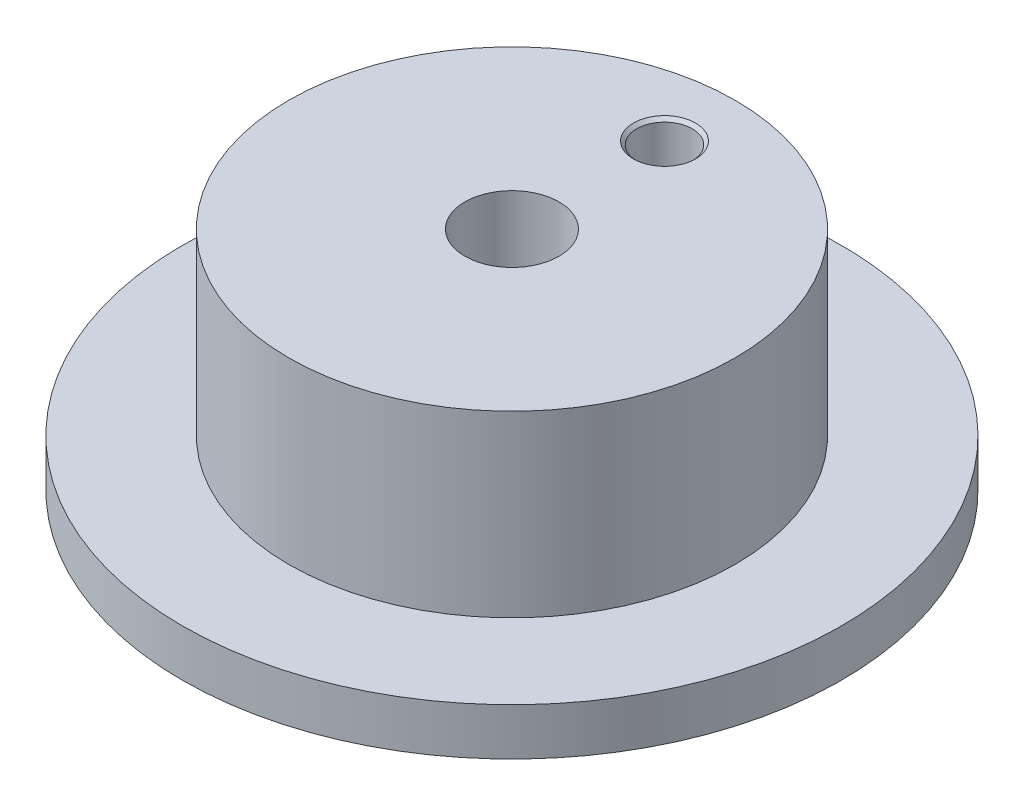
ISO-10303-21;
HEADER;
FILE_DESCRIPTION(('STEP AP214'),'2;1');
FILE_NAME('part.step','',(''),(''),'','','');
FILE_SCHEMA(('AUTOMOTIVE_DESIGN { 1 0 10303 214 1 1 1 1 }'));
ENDSEC;
DATA;
#1=APPLICATION_CONTEXT('core data for automotive mechanical design processes');
#2=APPLICATION_PROTOCOL_DEFINITION('international standard','automotive_design',2000,#1);
#3=PRODUCT_CONTEXT('',#1,'mechanical');
#4=PRODUCT('Part','Part','',(#3));
#5=PRODUCT_RELATED_PRODUCT_CATEGORY('part','',(#4));
#6=PRODUCT_DEFINITION_FORMATION('','',#4);
#7=PRODUCT_DEFINITION_CONTEXT('part definition',#1,'design');
#8=PRODUCT_DEFINITION('design','',#6,#7);
#9=PRODUCT_DEFINITION_SHAPE('','',#8);
#10=(LENGTH_UNIT() NAMED_UNIT(*) SI_UNIT(.MILLI.,.METRE.));
#11=(NAMED_UNIT(*) PLANE_ANGLE_UNIT() SI_UNIT($,.RADIAN.));
#12=(NAMED_UNIT(*) SI_UNIT($,.STERADIAN.) SOLID_ANGLE_UNIT());
#13=UNCERTAINTY_MEASURE_WITH_UNIT(LENGTH_MEASURE(1.E-05),#10,'distance_accuracy_value','');
#14=(GEOMETRIC_REPRESENTATION_CONTEXT(3) GLOBAL_UNCERTAINTY_ASSIGNED_CONTEXT((#13)) GLOBAL_UNIT_ASSIGNED_CONTEXT((#10,
#11,#12)) REPRESENTATION_CONTEXT('',''));
#15=CARTESIAN_POINT('',(0.,0.,0.));
#16=DIRECTION('',(0.,0.,1.));
#17=DIRECTION('',(1.,0.,0.));
#18=AXIS2_PLACEMENT_3D('',#15,#16,#17);
#19=CARTESIAN_POINT('',(-47.4,0.,0.));
#20=DIRECTION('',(0.,1.,0.));
#21=DIRECTION('',(0.,0.,1.));
#22=AXIS2_PLACEMENT_3D('',#19,#20,#21);
#23=PLANE('',#22);
#24=CARTESIAN_POINT('',(0.,0.,-32.4));
#25=DIRECTION('',(0.,1.,0.));
#26=DIRECTION('',(0.,0.,1.));
#27=AXIS2_PLACEMENT_3D('',#24,#25,#26);
#28=CIRCLE('',#27,6.6035);
#29=CARTESIAN_POINT('',(0.,0.,-25.7965));
#30=VERTEX_POINT('',#29);
#31=EDGE_CURVE('E195',#30,#30,#28,.T.);
#32=ORIENTED_EDGE('',*,*,#31,.F.);
#33=EDGE_LOOP('',(#32));
#34=FACE_BOUND('',#33,.T.);
#35=CARTESIAN_POINT('',(0.,0.,0.));
#36=DIRECTION('',(0.,1.,0.));
#37=DIRECTION('',(0.,0.,1.));
#38=AXIS2_PLACEMENT_3D('',#35,#36,#37);
#39=CIRCLE('',#38,47.4);
#40=CARTESIAN_POINT('',(0.,0.,47.4));
#41=VERTEX_POINT('',#40);
#42=EDGE_CURVE('E10',#41,#41,#39,.T.);
#43=ORIENTED_EDGE('',*,*,#42,.T.);
#44=EDGE_LOOP('',(#43));
#45=FACE_BOUND('',#44,.T.);
#46=CARTESIAN_POINT('',(0.,0.,0.));
#47=DIRECTION('',(0.,1.,0.));
#48=DIRECTION('',(0.,0.,1.));
#49=AXIS2_PLACEMENT_3D('',#46,#47,#48);
#50=CIRCLE('',#49,10.);
#51=CARTESIAN_POINT('',(0.,0.,10.));
#52=VERTEX_POINT('',#51);
#53=EDGE_CURVE('E183',#52,#52,#50,.T.);
#54=ORIENTED_EDGE('',*,*,#53,.F.);
#55=EDGE_LOOP('',(#54));
#56=FACE_BOUND('',#55,.T.);
#57=ADVANCED_FACE('F44',(#34,#45,#56),#23,.T.);
#58=CARTESIAN_POINT('',(0.,0.,0.));
#59=DIRECTION('',(0.,1.,0.));
#60=DIRECTION('',(0.,0.,1.));
#61=AXIS2_PLACEMENT_3D('',#58,#59,#60);
#62=CYLINDRICAL_SURFACE('',#61,47.4);
#63=CARTESIAN_POINT('',(0.,-38.,0.));
#64=DIRECTION('',(0.,1.,0.));
#65=DIRECTION('',(0.,0.,1.));
#66=AXIS2_PLACEMENT_3D('',#63,#64,#65);
#67=CIRCLE('',#66,47.4);
#68=CARTESIAN_POINT('',(0.,-38.,47.4));
#69=VERTEX_POINT('',#68);
#70=EDGE_CURVE('E51',#69,#69,#67,.T.);
#71=ORIENTED_EDGE('',*,*,#70,.T.);
#72=EDGE_LOOP('',(#71));
#73=FACE_BOUND('',#72,.T.);
#74=ORIENTED_EDGE('',*,*,#42,.F.);
#75=EDGE_LOOP('',(#74));
#76=FACE_BOUND('',#75,.T.);
#77=ADVANCED_FACE('F203',(#73,#76),#62,.T.);
#78=CARTESIAN_POINT('',(-70.,-38.,0.));
#79=DIRECTION('',(0.,1.,0.));
#80=DIRECTION('',(0.,0.,1.));
#81=AXIS2_PLACEMENT_3D('',#78,#79,#80);
#82=PLANE('',#81);
#83=CARTESIAN_POINT('',(0.,-38.,0.));
#84=DIRECTION('',(0.,1.,0.));
#85=DIRECTION('',(0.,0.,1.));
#86=AXIS2_PLACEMENT_3D('',#83,#84,#85);
#87=CIRCLE('',#86,70.);
#88=CARTESIAN_POINT('',(0.,-38.,70.));
#89=VERTEX_POINT('',#88);
#90=EDGE_CURVE('E56',#89,#89,#87,.T.);
#91=ORIENTED_EDGE('',*,*,#90,.T.);
#92=EDGE_LOOP('',(#91));
#93=FACE_BOUND('',#92,.T.);
#94=ORIENTED_EDGE('',*,*,#70,.F.);
#95=EDGE_LOOP('',(#94));
#96=FACE_BOUND('',#95,.T.);
#97=ADVANCED_FACE('F392',(#93,#96),#82,.T.);
#98=CARTESIAN_POINT('',(0.,0.,0.));
#99=DIRECTION('',(0.,1.,0.));
#100=DIRECTION('',(0.,0.,1.));
#101=AXIS2_PLACEMENT_3D('',#98,#99,#100);
#102=CYLINDRICAL_SURFACE('',#101,70.);
#103=CARTESIAN_POINT('',(0.,-48.,0.));
#104=DIRECTION('',(0.,1.,0.));
#105=DIRECTION('',(0.,0.,1.));
#106=AXIS2_PLACEMENT_3D('',#103,#104,#105);
#107=CIRCLE('',#106,70.);
#108=CARTESIAN_POINT('',(0.,-48.,70.));
#109=VERTEX_POINT('',#108);
#110=EDGE_CURVE('E61',#109,#109,#107,.T.);
#111=ORIENTED_EDGE('',*,*,#110,.T.);
#112=EDGE_LOOP('',(#111));
#113=FACE_BOUND('',#112,.T.);
#114=ORIENTED_EDGE('',*,*,#90,.F.);
#115=EDGE_LOOP('',(#114));
#116=FACE_BOUND('',#115,.T.);
#117=ADVANCED_FACE('F386',(#113,#116),#102,.T.);
#118=CARTESIAN_POINT('',(-51.,-48.,0.));
#119=DIRECTION('',(0.,-1.,0.));
#120=DIRECTION('',(0.,0.,-1.));
#121=AXIS2_PLACEMENT_3D('',#118,#119,#120);
#122=PLANE('',#121);
#123=CARTESIAN_POINT('',(0.,-48.,0.));
#124=DIRECTION('',(0.,1.,0.));
#125=DIRECTION('',(0.,0.,1.));
#126=AXIS2_PLACEMENT_3D('',#123,#124,#125);
#127=CIRCLE('',#126,51.);
#128=CARTESIAN_POINT('',(0.,-48.,51.));
#129=VERTEX_POINT('',#128);
#130=EDGE_CURVE('E67',#129,#129,#127,.T.);
#131=ORIENTED_EDGE('',*,*,#130,.T.);
#132=EDGE_LOOP('',(#131));
#133=FACE_BOUND('',#132,.T.);
#134=ORIENTED_EDGE('',*,*,#110,.F.);
#135=EDGE_LOOP('',(#134));
#136=FACE_BOUND('',#135,.T.);
#137=ADVANCED_FACE('F380',(#133,#136),#122,.T.);
#138=CARTESIAN_POINT('',(0.,0.,0.));
#139=DIRECTION('',(0.,1.,0.));
#140=DIRECTION('',(0.,0.,1.));
#141=AXIS2_PLACEMENT_3D('',#138,#139,#140);
#142=CYLINDRICAL_SURFACE('',#141,51.);
#143=CARTESIAN_POINT('',(0.,-46.2080332580664,0.));
#144=DIRECTION('',(0.,1.,0.));
#145=DIRECTION('',(0.,0.,1.));
#146=AXIS2_PLACEMENT_3D('',#143,#144,#145);
#147=CIRCLE('',#146,51.);
#148=CARTESIAN_POINT('',(0.,-46.2080332580664,51.));
#149=VERTEX_POINT('',#148);
#150=EDGE_CURVE('E71',#149,#149,#147,.T.);
#151=ORIENTED_EDGE('',*,*,#150,.T.);
#152=EDGE_LOOP('',(#151));
#153=FACE_BOUND('',#152,.T.);
#154=ORIENTED_EDGE('',*,*,#130,.F.);
#155=EDGE_LOOP('',(#154));
#156=FACE_BOUND('',#155,.T.);
#157=ADVANCED_FACE('F374',(#153,#156),#142,.F.);
#158=CARTESIAN_POINT('',(0.,-46.2080332580664,0.));
#159=DIRECTION('',(0.,1.,0.));
#160=DIRECTION('',(0.,0.,1.));
#161=AXIS2_PLACEMENT_3D('',#158,#159,#160);
#162=TOROIDAL_SURFACE('',#161,50.7919667419336,0.208033258066391);
#163=CARTESIAN_POINT('',(0.,-46.,0.));
#164=DIRECTION('',(0.,1.,0.));
#165=DIRECTION('',(0.,0.,1.));
#166=AXIS2_PLACEMENT_3D('',#163,#164,#165);
#167=CIRCLE('',#166,50.7919667419336);
#168=CARTESIAN_POINT('',(0.,-46.,50.7919667419336));
#169=VERTEX_POINT('',#168);
#170=EDGE_CURVE('E75',#169,#169,#167,.T.);
#171=ORIENTED_EDGE('',*,*,#170,.T.);
#172=EDGE_LOOP('',(#171));
#173=FACE_BOUND('',#172,.T.);
#174=ORIENTED_EDGE('',*,*,#150,.F.);
#175=EDGE_LOOP('',(#174));
#176=FACE_BOUND('',#175,.T.);
#177=ADVANCED_FACE('F368',(#173,#176),#162,.F.);
#178=CARTESIAN_POINT('',(-47.9580332580664,-46.,0.));
#179=DIRECTION('',(0.,-1.,0.));
#180=DIRECTION('',(0.,0.,-1.));
#181=AXIS2_PLACEMENT_3D('',#178,#179,#180);
#182=PLANE('',#181);
#183=CARTESIAN_POINT('',(0.,-46.,0.));
#184=DIRECTION('',(0.,1.,0.));
#185=DIRECTION('',(0.,0.,1.));
#186=AXIS2_PLACEMENT_3D('',#183,#184,#185);
#187=CIRCLE('',#186,47.9580332580664);
#188=CARTESIAN_POINT('',(0.,-46.,47.9580332580664));
#189=VERTEX_POINT('',#188);
#190=EDGE_CURVE('E79',#189,#189,#187,.T.);
#191=ORIENTED_EDGE('',*,*,#190,.T.);
#192=EDGE_LOOP('',(#191));
#193=FACE_BOUND('',#192,.T.);
#194=ORIENTED_EDGE('',*,*,#170,.F.);
#195=EDGE_LOOP('',(#194));
#196=FACE_BOUND('',#195,.T.);
#197=ADVANCED_FACE('F362',(#193,#196),#182,.T.);
#198=CARTESIAN_POINT('',(0.,-46.2080332580664,0.));
#199=DIRECTION('',(0.,1.,0.));
#200=DIRECTION('',(0.,0.,1.));
#201=AXIS2_PLACEMENT_3D('',#198,#199,#200);
#202=TOROIDAL_SURFACE('',#201,47.9580332580664,0.208033258066391);
#203=CARTESIAN_POINT('',(0.,-46.2080332580664,0.));
#204=DIRECTION('',(0.,1.,0.));
#205=DIRECTION('',(0.,0.,1.));
#206=AXIS2_PLACEMENT_3D('',#203,#204,#205);
#207=CIRCLE('',#206,47.75);
#208=CARTESIAN_POINT('',(0.,-46.2080332580664,47.75));
#209=VERTEX_POINT('',#208);
#210=EDGE_CURVE('E83',#209,#209,#207,.T.);
#211=ORIENTED_EDGE('',*,*,#210,.T.);
#212=EDGE_LOOP('',(#211));
#213=FACE_BOUND('',#212,.T.);
#214=ORIENTED_EDGE('',*,*,#190,.F.);
#215=EDGE_LOOP('',(#214));
#216=FACE_BOUND('',#215,.T.);
#217=ADVANCED_FACE('F356',(#213,#216),#202,.F.);
#218=CARTESIAN_POINT('',(0.,0.,0.));
#219=DIRECTION('',(0.,1.,0.));
#220=DIRECTION('',(0.,0.,1.));
#221=AXIS2_PLACEMENT_3D('',#218,#219,#220);
#222=CYLINDRICAL_SURFACE('',#221,47.75);
#223=CARTESIAN_POINT('',(0.,-48.,0.));
#224=DIRECTION('',(0.,1.,0.));
#225=DIRECTION('',(0.,0.,1.));
#226=AXIS2_PLACEMENT_3D('',#223,#224,#225);
#227=CIRCLE('',#226,47.75);
#228=CARTESIAN_POINT('',(0.,-48.,47.75));
#229=VERTEX_POINT('',#228);
#230=EDGE_CURVE('E87',#229,#229,#227,.T.);
#231=ORIENTED_EDGE('',*,*,#230,.T.);
#232=EDGE_LOOP('',(#231));
#233=FACE_BOUND('',#232,.T.);
#234=ORIENTED_EDGE('',*,*,#210,.F.);
#235=EDGE_LOOP('',(#234));
#236=FACE_BOUND('',#235,.T.);
#237=ADVANCED_FACE('F350',(#233,#236),#222,.T.);
#238=CARTESIAN_POINT('',(-45.25,-48.,0.));
#239=DIRECTION('',(0.,-1.,0.));
#240=DIRECTION('',(0.,0.,-1.));
#241=AXIS2_PLACEMENT_3D('',#238,#239,#240);
#242=PLANE('',#241);
#243=CARTESIAN_POINT('',(0.,-48.,0.));
#244=DIRECTION('',(0.,1.,0.));
#245=DIRECTION('',(0.,0.,1.));
#246=AXIS2_PLACEMENT_3D('',#243,#244,#245);
#247=CIRCLE('',#246,45.25);
#248=CARTESIAN_POINT('',(0.,-48.,45.25));
#249=VERTEX_POINT('',#248);
#250=EDGE_CURVE('E91',#249,#249,#247,.T.);
#251=ORIENTED_EDGE('',*,*,#250,.T.);
#252=EDGE_LOOP('',(#251));
#253=FACE_BOUND('',#252,.T.);
#254=ORIENTED_EDGE('',*,*,#230,.F.);
#255=EDGE_LOOP('',(#254));
#256=FACE_BOUND('',#255,.T.);
#257=ADVANCED_FACE('F344',(#253,#256),#242,.T.);
#258=CARTESIAN_POINT('',(0.,0.,0.));
#259=DIRECTION('',(0.,1.,0.));
#260=DIRECTION('',(0.,0.,1.));
#261=AXIS2_PLACEMENT_3D('',#258,#259,#260);
#262=CYLINDRICAL_SURFACE('',#261,45.25);
#263=CARTESIAN_POINT('',(0.,-46.2080332580664,0.));
#264=DIRECTION('',(0.,1.,0.));
#265=DIRECTION('',(0.,0.,1.));
#266=AXIS2_PLACEMENT_3D('',#263,#264,#265);
#267=CIRCLE('',#266,45.25);
#268=CARTESIAN_POINT('',(0.,-46.2080332580664,45.25));
#269=VERTEX_POINT('',#268);
#270=EDGE_CURVE('E95',#269,#269,#267,.T.);
#271=ORIENTED_EDGE('',*,*,#270,.T.);
#272=EDGE_LOOP('',(#271));
#273=FACE_BOUND('',#272,.T.);
#274=ORIENTED_EDGE('',*,*,#250,.F.);
#275=EDGE_LOOP('',(#274));
#276=FACE_BOUND('',#275,.T.);
#277=ADVANCED_FACE('F338',(#273,#276),#262,.F.);
#278=CARTESIAN_POINT('',(0.,-46.2080332580664,0.));
#279=DIRECTION('',(0.,1.,0.));
#280=DIRECTION('',(0.,0.,1.));
#281=AXIS2_PLACEMENT_3D('',#278,#279,#280);
#282=TOROIDAL_SURFACE('',#281,45.0419667419336,0.208033258066391);
#283=CARTESIAN_POINT('',(0.,-46.,0.));
#284=DIRECTION('',(0.,1.,0.));
#285=DIRECTION('',(0.,0.,1.));
#286=AXIS2_PLACEMENT_3D('',#283,#284,#285);
#287=CIRCLE('',#286,45.0419667419336);
#288=CARTESIAN_POINT('',(0.,-46.,45.0419667419336));
#289=VERTEX_POINT('',#288);
#290=EDGE_CURVE('E99',#289,#289,#287,.T.);
#291=ORIENTED_EDGE('',*,*,#290,.T.);
#292=EDGE_LOOP('',(#291));
#293=FACE_BOUND('',#292,.T.);
#294=ORIENTED_EDGE('',*,*,#270,.F.);
#295=EDGE_LOOP('',(#294));
#296=FACE_BOUND('',#295,.T.);
#297=ADVANCED_FACE('F332',(#293,#296),#282,.F.);
#298=CARTESIAN_POINT('',(-42.2080332580664,-46.,0.));
#299=DIRECTION('',(0.,-1.,0.));
#300=DIRECTION('',(0.,0.,-1.));
#301=AXIS2_PLACEMENT_3D('',#298,#299,#300);
#302=PLANE('',#301);
#303=CARTESIAN_POINT('',(0.,-46.,0.));
#304=DIRECTION('',(0.,1.,0.));
#305=DIRECTION('',(0.,0.,1.));
#306=AXIS2_PLACEMENT_3D('',#303,#304,#305);
#307=CIRCLE('',#306,42.2080332580664);
#308=CARTESIAN_POINT('',(0.,-46.,42.2080332580664));
#309=VERTEX_POINT('',#308);
#310=EDGE_CURVE('E103',#309,#309,#307,.T.);
#311=ORIENTED_EDGE('',*,*,#310,.T.);
#312=EDGE_LOOP('',(#311));
#313=FACE_BOUND('',#312,.T.);
#314=ORIENTED_EDGE('',*,*,#290,.F.);
#315=EDGE_LOOP('',(#314));
#316=FACE_BOUND('',#315,.T.);
#317=ADVANCED_FACE('F326',(#313,#316),#302,.T.);
#318=CARTESIAN_POINT('',(0.,-46.2080332580664,0.));
#319=DIRECTION('',(0.,1.,0.));
#320=DIRECTION('',(0.,0.,1.));
#321=AXIS2_PLACEMENT_3D('',#318,#319,#320);
#322=TOROIDAL_SURFACE('',#321,42.2080332580664,0.208033258066391);
#323=CARTESIAN_POINT('',(0.,-46.2080332580664,0.));
#324=DIRECTION('',(0.,1.,0.));
#325=DIRECTION('',(0.,0.,1.));
#326=AXIS2_PLACEMENT_3D('',#323,#324,#325);
#327=CIRCLE('',#326,42.);
#328=CARTESIAN_POINT('',(0.,-46.2080332580664,42.));
#329=VERTEX_POINT('',#328);
#330=EDGE_CURVE('E107',#329,#329,#327,.T.);
#331=ORIENTED_EDGE('',*,*,#330,.T.);
#332=EDGE_LOOP('',(#331));
#333=FACE_BOUND('',#332,.T.);
#334=ORIENTED_EDGE('',*,*,#310,.F.);
#335=EDGE_LOOP('',(#334));
#336=FACE_BOUND('',#335,.T.);
#337=ADVANCED_FACE('F320',(#333,#336),#322,.F.);
#338=CARTESIAN_POINT('',(0.,0.,0.));
#339=DIRECTION('',(0.,1.,0.));
#340=DIRECTION('',(0.,0.,1.));
#341=AXIS2_PLACEMENT_3D('',#338,#339,#340);
#342=CYLINDRICAL_SURFACE('',#341,42.);
#343=CARTESIAN_POINT('',(0.,-48.,0.));
#344=DIRECTION('',(0.,1.,0.));
#345=DIRECTION('',(0.,0.,1.));
#346=AXIS2_PLACEMENT_3D('',#343,#344,#345);
#347=CIRCLE('',#346,42.);
#348=CARTESIAN_POINT('',(0.,-48.,42.));
#349=VERTEX_POINT('',#348);
#350=EDGE_CURVE('E111',#349,#349,#347,.T.);
#351=ORIENTED_EDGE('',*,*,#350,.T.);
#352=EDGE_LOOP('',(#351));
#353=FACE_BOUND('',#352,.T.);
#354=ORIENTED_EDGE('',*,*,#330,.F.);
#355=EDGE_LOOP('',(#354));
#356=FACE_BOUND('',#355,.T.);
#357=ADVANCED_FACE('F314',(#353,#356),#342,.T.);
#358=CARTESIAN_POINT('',(-39.4,-48.,0.));
#359=DIRECTION('',(0.,-1.,0.));
#360=DIRECTION('',(0.,0.,-1.));
#361=AXIS2_PLACEMENT_3D('',#358,#359,#360);
#362=PLANE('',#361);
#363=CARTESIAN_POINT('',(0.,-48.,0.));
#364=DIRECTION('',(0.,1.,0.));
#365=DIRECTION('',(0.,0.,1.));
#366=AXIS2_PLACEMENT_3D('',#363,#364,#365);
#367=CIRCLE('',#366,39.4);
#368=CARTESIAN_POINT('',(0.,-48.,39.4));
#369=VERTEX_POINT('',#368);
#370=EDGE_CURVE('E115',#369,#369,#367,.T.);
#371=ORIENTED_EDGE('',*,*,#370,.T.);
#372=EDGE_LOOP('',(#371));
#373=FACE_BOUND('',#372,.T.);
#374=ORIENTED_EDGE('',*,*,#350,.F.);
#375=EDGE_LOOP('',(#374));
#376=FACE_BOUND('',#375,.T.);
#377=ADVANCED_FACE('F308',(#373,#376),#362,.T.);
#378=CARTESIAN_POINT('',(0.,0.,0.));
#379=DIRECTION('',(0.,1.,0.));
#380=DIRECTION('',(0.,0.,1.));
#381=AXIS2_PLACEMENT_3D('',#378,#379,#380);
#382=CYLINDRICAL_SURFACE('',#381,39.4);
#383=CARTESIAN_POINT('',(0.,-20.,0.));
#384=DIRECTION('',(0.,1.,0.));
#385=DIRECTION('',(0.,0.,1.));
#386=AXIS2_PLACEMENT_3D('',#383,#384,#385);
#387=CIRCLE('',#386,39.4);
#388=CARTESIAN_POINT('',(0.,-20.,39.4));
#389=VERTEX_POINT('',#388);
#390=EDGE_CURVE('E119',#389,#389,#387,.T.);
#391=ORIENTED_EDGE('',*,*,#390,.T.);
#392=EDGE_LOOP('',(#391));
#393=FACE_BOUND('',#392,.T.);
#394=ORIENTED_EDGE('',*,*,#370,.F.);
#395=EDGE_LOOP('',(#394));
#396=FACE_BOUND('',#395,.T.);
#397=ADVANCED_FACE('F301',(#393,#396),#382,.F.);
#398=CARTESIAN_POINT('',(-39.4,-20.,0.));
#399=DIRECTION('',(0.,-1.,0.));
#400=DIRECTION('',(0.,0.,-1.));
#401=AXIS2_PLACEMENT_3D('',#398,#399,#400);
#402=PLANE('',#401);
#403=CARTESIAN_POINT('',(0.,-20.,-32.4));
#404=DIRECTION('',(0.,-1.,0.));
#405=DIRECTION('',(0.,0.,-1.));
#406=AXIS2_PLACEMENT_3D('',#403,#404,#405);
#407=CIRCLE('',#406,5.9);
#408=CARTESIAN_POINT('',(0.,-20.,-38.3));
#409=VERTEX_POINT('',#408);
#410=EDGE_CURVE('E187',#409,#409,#407,.T.);
#411=ORIENTED_EDGE('',*,*,#410,.F.);
#412=EDGE_LOOP('',(#411));
#413=FACE_BOUND('',#412,.T.);
#414=CARTESIAN_POINT('',(0.,-20.,0.));
#415=DIRECTION('',(0.,1.,0.));
#416=DIRECTION('',(0.,0.,1.));
#417=AXIS2_PLACEMENT_3D('',#414,#415,#416);
#418=CIRCLE('',#417,24.);
#419=CARTESIAN_POINT('',(0.,-20.,24.));
#420=VERTEX_POINT('',#419);
#421=EDGE_CURVE('E123',#420,#420,#418,.T.);
#422=ORIENTED_EDGE('',*,*,#421,.T.);
#423=EDGE_LOOP('',(#422));
#424=FACE_BOUND('',#423,.T.);
#425=ORIENTED_EDGE('',*,*,#390,.F.);
#426=EDGE_LOOP('',(#425));
#427=FACE_BOUND('',#426,.T.);
#428=ADVANCED_FACE('F295',(#413,#424,#427),#402,.T.);
#429=CARTESIAN_POINT('',(0.,0.,0.));
#430=DIRECTION('',(0.,1.,0.));
#431=DIRECTION('',(0.,0.,1.));
#432=AXIS2_PLACEMENT_3D('',#429,#430,#431);
#433=CYLINDRICAL_SURFACE('',#432,24.);
#434=CARTESIAN_POINT('',(0.,-48.,0.));
#435=DIRECTION('',(0.,1.,0.));
#436=DIRECTION('',(0.,0.,1.));
#437=AXIS2_PLACEMENT_3D('',#434,#435,#436);
#438=CIRCLE('',#437,24.);
#439=CARTESIAN_POINT('',(0.,-48.,24.));
#440=VERTEX_POINT('',#439);
#441=EDGE_CURVE('E127',#440,#440,#438,.T.);
#442=ORIENTED_EDGE('',*,*,#441,.T.);
#443=EDGE_LOOP('',(#442));
#444=FACE_BOUND('',#443,.T.);
#445=ORIENTED_EDGE('',*,*,#421,.F.);
#446=EDGE_LOOP('',(#445));
#447=FACE_BOUND('',#446,.T.);
#448=ADVANCED_FACE('F289',(#444,#447),#433,.T.);
#449=CARTESIAN_POINT('',(-21.75,-48.,0.));
#450=DIRECTION('',(0.,-1.,0.));
#451=DIRECTION('',(0.,0.,-1.));
#452=AXIS2_PLACEMENT_3D('',#449,#450,#451);
#453=PLANE('',#452);
#454=CARTESIAN_POINT('',(0.,-48.,0.));
#455=DIRECTION('',(0.,1.,0.));
#456=DIRECTION('',(0.,0.,1.));
#457=AXIS2_PLACEMENT_3D('',#454,#455,#456);
#458=CIRCLE('',#457,21.75);
#459=CARTESIAN_POINT('',(0.,-48.,21.75));
#460=VERTEX_POINT('',#459);
#461=EDGE_CURVE('E131',#460,#460,#458,.T.);
#462=ORIENTED_EDGE('',*,*,#461,.T.);
#463=EDGE_LOOP('',(#462));
#464=FACE_BOUND('',#463,.T.);
#465=ORIENTED_EDGE('',*,*,#441,.F.);
#466=EDGE_LOOP('',(#465));
#467=FACE_BOUND('',#466,.T.);
#468=ADVANCED_FACE('F283',(#464,#467),#453,.T.);
#469=CARTESIAN_POINT('',(0.,0.,0.));
#470=DIRECTION('',(0.,1.,0.));
#471=DIRECTION('',(0.,0.,1.));
#472=AXIS2_PLACEMENT_3D('',#469,#470,#471);
#473=CYLINDRICAL_SURFACE('',#472,21.75);
#474=CARTESIAN_POINT('',(0.,-46.2080332580664,0.));
#475=DIRECTION('',(0.,1.,0.));
#476=DIRECTION('',(0.,0.,1.));
#477=AXIS2_PLACEMENT_3D('',#474,#475,#476);
#478=CIRCLE('',#477,21.75);
#479=CARTESIAN_POINT('',(0.,-46.2080332580664,21.75));
#480=VERTEX_POINT('',#479);
#481=EDGE_CURVE('E135',#480,#480,#478,.T.);
#482=ORIENTED_EDGE('',*,*,#481,.T.);
#483=EDGE_LOOP('',(#482));
#484=FACE_BOUND('',#483,.T.);
#485=ORIENTED_EDGE('',*,*,#461,.F.);
#486=EDGE_LOOP('',(#485));
#487=FACE_BOUND('',#486,.T.);
#488=ADVANCED_FACE('F277',(#484,#487),#473,.F.);
#489=CARTESIAN_POINT('',(0.,-46.2080332580664,0.));
#490=DIRECTION('',(0.,1.,0.));
#491=DIRECTION('',(0.,0.,1.));
#492=AXIS2_PLACEMENT_3D('',#489,#490,#491);
#493=TOROIDAL_SURFACE('',#492,21.5419667419336,0.208033258066391);
#494=CARTESIAN_POINT('',(0.,-46.,0.));
#495=DIRECTION('',(0.,1.,0.));
#496=DIRECTION('',(0.,0.,1.));
#497=AXIS2_PLACEMENT_3D('',#494,#495,#496);
#498=CIRCLE('',#497,21.5419667419336);
#499=CARTESIAN_POINT('',(0.,-46.,21.5419667419336));
#500=VERTEX_POINT('',#499);
#501=EDGE_CURVE('E139',#500,#500,#498,.T.);
#502=ORIENTED_EDGE('',*,*,#501,.T.);
#503=EDGE_LOOP('',(#502));
#504=FACE_BOUND('',#503,.T.);
#505=ORIENTED_EDGE('',*,*,#481,.F.);
#506=EDGE_LOOP('',(#505));
#507=FACE_BOUND('',#506,.T.);
#508=ADVANCED_FACE('F271',(#504,#507),#493,.F.);
#509=CARTESIAN_POINT('',(-18.7080332580664,-46.,0.));
#510=DIRECTION('',(0.,-1.,0.));
#511=DIRECTION('',(0.,0.,-1.));
#512=AXIS2_PLACEMENT_3D('',#509,#510,#511);
#513=PLANE('',#512);
#514=CARTESIAN_POINT('',(0.,-46.,0.));
#515=DIRECTION('',(0.,1.,0.));
#516=DIRECTION('',(0.,0.,1.));
#517=AXIS2_PLACEMENT_3D('',#514,#515,#516);
#518=CIRCLE('',#517,18.7080332580664);
#519=CARTESIAN_POINT('',(0.,-46.,18.7080332580664));
#520=VERTEX_POINT('',#519);
#521=EDGE_CURVE('E143',#520,#520,#518,.T.);
#522=ORIENTED_EDGE('',*,*,#521,.T.);
#523=EDGE_LOOP('',(#522));
#524=FACE_BOUND('',#523,.T.);
#525=ORIENTED_EDGE('',*,*,#501,.F.);
#526=EDGE_LOOP('',(#525));
#527=FACE_BOUND('',#526,.T.);
#528=ADVANCED_FACE('F265',(#524,#527),#513,.T.);
#529=CARTESIAN_POINT('',(0.,-46.2080332580664,0.));
#530=DIRECTION('',(0.,1.,0.));
#531=DIRECTION('',(0.,0.,1.));
#532=AXIS2_PLACEMENT_3D('',#529,#530,#531);
#533=TOROIDAL_SURFACE('',#532,18.7080332580664,0.208033258066391);
#534=CARTESIAN_POINT('',(0.,-46.2080332580664,0.));
#535=DIRECTION('',(0.,1.,0.));
#536=DIRECTION('',(0.,0.,1.));
#537=AXIS2_PLACEMENT_3D('',#534,#535,#536);
#538=CIRCLE('',#537,18.5);
#539=CARTESIAN_POINT('',(0.,-46.2080332580664,18.5));
#540=VERTEX_POINT('',#539);
#541=EDGE_CURVE('E147',#540,#540,#538,.T.);
#542=ORIENTED_EDGE('',*,*,#541,.T.);
#543=EDGE_LOOP('',(#542));
#544=FACE_BOUND('',#543,.T.);
#545=ORIENTED_EDGE('',*,*,#521,.F.);
#546=EDGE_LOOP('',(#545));
#547=FACE_BOUND('',#546,.T.);
#548=ADVANCED_FACE('F259',(#544,#547),#533,.F.);
#549=CARTESIAN_POINT('',(0.,0.,0.));
#550=DIRECTION('',(0.,1.,0.));
#551=DIRECTION('',(0.,0.,1.));
#552=AXIS2_PLACEMENT_3D('',#549,#550,#551);
#553=CYLINDRICAL_SURFACE('',#552,18.5);
#554=CARTESIAN_POINT('',(0.,-48.,0.));
#555=DIRECTION('',(0.,1.,0.));
#556=DIRECTION('',(0.,0.,1.));
#557=AXIS2_PLACEMENT_3D('',#554,#555,#556);
#558=CIRCLE('',#557,18.5);
#559=CARTESIAN_POINT('',(0.,-48.,18.5));
#560=VERTEX_POINT('',#559);
#561=EDGE_CURVE('E151',#560,#560,#558,.T.);
#562=ORIENTED_EDGE('',*,*,#561,.T.);
#563=EDGE_LOOP('',(#562));
#564=FACE_BOUND('',#563,.T.);
#565=ORIENTED_EDGE('',*,*,#541,.F.);
#566=EDGE_LOOP('',(#565));
#567=FACE_BOUND('',#566,.T.);
#568=ADVANCED_FACE('F253',(#564,#567),#553,.T.);
#569=CARTESIAN_POINT('',(-15.75,-48.,0.));
#570=DIRECTION('',(0.,-1.,0.));
#571=DIRECTION('',(0.,0.,-1.));
#572=AXIS2_PLACEMENT_3D('',#569,#570,#571);
#573=PLANE('',#572);
#574=CARTESIAN_POINT('',(0.,-48.,0.));
#575=DIRECTION('',(0.,1.,0.));
#576=DIRECTION('',(0.,0.,1.));
#577=AXIS2_PLACEMENT_3D('',#574,#575,#576);
#578=CIRCLE('',#577,15.75);
#579=CARTESIAN_POINT('',(0.,-48.,15.75));
#580=VERTEX_POINT('',#579);
#581=EDGE_CURVE('E155',#580,#580,#578,.T.);
#582=ORIENTED_EDGE('',*,*,#581,.T.);
#583=EDGE_LOOP('',(#582));
#584=FACE_BOUND('',#583,.T.);
#585=ORIENTED_EDGE('',*,*,#561,.F.);
#586=EDGE_LOOP('',(#585));
#587=FACE_BOUND('',#586,.T.);
#588=ADVANCED_FACE('F247',(#584,#587),#573,.T.);
#589=CARTESIAN_POINT('',(0.,0.,0.));
#590=DIRECTION('',(0.,1.,0.));
#591=DIRECTION('',(0.,0.,1.));
#592=AXIS2_PLACEMENT_3D('',#589,#590,#591);
#593=CYLINDRICAL_SURFACE('',#592,15.75);
#594=CARTESIAN_POINT('',(0.,-46.2080332580664,0.));
#595=DIRECTION('',(0.,1.,0.));
#596=DIRECTION('',(0.,0.,1.));
#597=AXIS2_PLACEMENT_3D('',#594,#595,#596);
#598=CIRCLE('',#597,15.75);
#599=CARTESIAN_POINT('',(0.,-46.2080332580664,15.75));
#600=VERTEX_POINT('',#599);
#601=EDGE_CURVE('E159',#600,#600,#598,.T.);
#602=ORIENTED_EDGE('',*,*,#601,.T.);
#603=EDGE_LOOP('',(#602));
#604=FACE_BOUND('',#603,.T.);
#605=ORIENTED_EDGE('',*,*,#581,.F.);
#606=EDGE_LOOP('',(#605));
#607=FACE_BOUND('',#606,.T.);
#608=ADVANCED_FACE('F241',(#604,#607),#593,.F.);
#609=CARTESIAN_POINT('',(0.,-46.2080332580664,0.));
#610=DIRECTION('',(0.,1.,0.));
#611=DIRECTION('',(0.,0.,1.));
#612=AXIS2_PLACEMENT_3D('',#609,#610,#611);
#613=TOROIDAL_SURFACE('',#612,15.5419667419336,0.208033258066391);
#614=CARTESIAN_POINT('',(0.,-46.,0.));
#615=DIRECTION('',(0.,1.,0.));
#616=DIRECTION('',(0.,0.,1.));
#617=AXIS2_PLACEMENT_3D('',#614,#615,#616);
#618=CIRCLE('',#617,15.5419667419336);
#619=CARTESIAN_POINT('',(0.,-46.,15.5419667419336));
#620=VERTEX_POINT('',#619);
#621=EDGE_CURVE('E163',#620,#620,#618,.T.);
#622=ORIENTED_EDGE('',*,*,#621,.T.);
#623=EDGE_LOOP('',(#622));
#624=FACE_BOUND('',#623,.T.);
#625=ORIENTED_EDGE('',*,*,#601,.F.);
#626=EDGE_LOOP('',(#625));
#627=FACE_BOUND('',#626,.T.);
#628=ADVANCED_FACE('F235',(#624,#627),#613,.F.);
#629=CARTESIAN_POINT('',(-12.7,-46.,0.));
#630=DIRECTION('',(0.,-1.,0.));
#631=DIRECTION('',(0.,0.,-1.));
#632=AXIS2_PLACEMENT_3D('',#629,#630,#631);
#633=PLANE('',#632);
#634=CARTESIAN_POINT('',(0.,-46.,0.));
#635=DIRECTION('',(0.,1.,0.));
#636=DIRECTION('',(0.,0.,1.));
#637=AXIS2_PLACEMENT_3D('',#634,#635,#636);
#638=CIRCLE('',#637,12.7);
#639=CARTESIAN_POINT('',(0.,-46.,12.7));
#640=VERTEX_POINT('',#639);
#641=EDGE_CURVE('E167',#640,#640,#638,.T.);
#642=ORIENTED_EDGE('',*,*,#641,.T.);
#643=EDGE_LOOP('',(#642));
#644=FACE_BOUND('',#643,.T.);
#645=ORIENTED_EDGE('',*,*,#621,.F.);
#646=EDGE_LOOP('',(#645));
#647=FACE_BOUND('',#646,.T.);
#648=ADVANCED_FACE('F229',(#644,#647),#633,.T.);
#649=CARTESIAN_POINT('',(0.,-46.2,0.));
#650=DIRECTION('',(0.,1.,0.));
#651=DIRECTION('',(0.,0.,1.));
#652=AXIS2_PLACEMENT_3D('',#649,#650,#651);
#653=TOROIDAL_SURFACE('',#652,12.7,0.2);
#654=CARTESIAN_POINT('',(0.,-46.2,0.));
#655=DIRECTION('',(0.,1.,0.));
#656=DIRECTION('',(0.,0.,1.));
#657=AXIS2_PLACEMENT_3D('',#654,#655,#656);
#658=CIRCLE('',#657,12.5);
#659=CARTESIAN_POINT('',(0.,-46.2,12.5));
#660=VERTEX_POINT('',#659);
#661=EDGE_CURVE('E171',#660,#660,#658,.T.);
#662=ORIENTED_EDGE('',*,*,#661,.T.);
#663=EDGE_LOOP('',(#662));
#664=FACE_BOUND('',#663,.T.);
#665=ORIENTED_EDGE('',*,*,#641,.F.);
#666=EDGE_LOOP('',(#665));
#667=FACE_BOUND('',#666,.T.);
#668=ADVANCED_FACE('F223',(#664,#667),#653,.F.);
#669=CARTESIAN_POINT('',(0.,0.,0.));
#670=DIRECTION('',(0.,1.,0.));
#671=DIRECTION('',(0.,0.,1.));
#672=AXIS2_PLACEMENT_3D('',#669,#670,#671);
#673=CYLINDRICAL_SURFACE('',#672,12.5);
#674=CARTESIAN_POINT('',(0.,-48.,0.));
#675=DIRECTION('',(0.,1.,0.));
#676=DIRECTION('',(0.,0.,1.));
#677=AXIS2_PLACEMENT_3D('',#674,#675,#676);
#678=CIRCLE('',#677,12.5);
#679=CARTESIAN_POINT('',(0.,-48.,12.5));
#680=VERTEX_POINT('',#679);
#681=EDGE_CURVE('E175',#680,#680,#678,.T.);
#682=ORIENTED_EDGE('',*,*,#681,.T.);
#683=EDGE_LOOP('',(#682));
#684=FACE_BOUND('',#683,.T.);
#685=ORIENTED_EDGE('',*,*,#661,.F.);
#686=EDGE_LOOP('',(#685));
#687=FACE_BOUND('',#686,.T.);
#688=ADVANCED_FACE('F217',(#684,#687),#673,.T.);
#689=CARTESIAN_POINT('',(-10.,-48.,0.));
#690=DIRECTION('',(0.,-1.,0.));
#691=DIRECTION('',(0.,0.,-1.));
#692=AXIS2_PLACEMENT_3D('',#689,#690,#691);
#693=PLANE('',#692);
#694=CARTESIAN_POINT('',(0.,-48.,0.));
#695=DIRECTION('',(0.,1.,0.));
#696=DIRECTION('',(0.,0.,1.));
#697=AXIS2_PLACEMENT_3D('',#694,#695,#696);
#698=CIRCLE('',#697,10.);
#699=CARTESIAN_POINT('',(0.,-48.,10.));
#700=VERTEX_POINT('',#699);
#701=EDGE_CURVE('E179',#700,#700,#698,.T.);
#702=ORIENTED_EDGE('',*,*,#701,.T.);
#703=EDGE_LOOP('',(#702));
#704=FACE_BOUND('',#703,.T.);
#705=ORIENTED_EDGE('',*,*,#681,.F.);
#706=EDGE_LOOP('',(#705));
#707=FACE_BOUND('',#706,.T.);
#708=ADVANCED_FACE('F211',(#704,#707),#693,.T.);
#709=CARTESIAN_POINT('',(0.,0.,0.));
#710=DIRECTION('',(0.,1.,0.));
#711=DIRECTION('',(0.,0.,1.));
#712=AXIS2_PLACEMENT_3D('',#709,#710,#711);
#713=CYLINDRICAL_SURFACE('',#712,10.);
#714=ORIENTED_EDGE('',*,*,#53,.T.);
#715=EDGE_LOOP('',(#714));
#716=FACE_BOUND('',#715,.T.);
#717=ORIENTED_EDGE('',*,*,#701,.F.);
#718=EDGE_LOOP('',(#717));
#719=FACE_BOUND('',#718,.T.);
#720=ADVANCED_FACE('F207',(#716,#719),#713,.F.);
#721=CARTESIAN_POINT('',(0.,0.,-32.4));
#722=DIRECTION('',(0.,1.,0.));
#723=DIRECTION('',(0.,0.,1.));
#724=AXIS2_PLACEMENT_3D('',#721,#722,#723);
#725=CYLINDRICAL_SURFACE('',#724,5.9);
#726=CARTESIAN_POINT('',(0.,-0.703499999999997,-32.4));
#727=DIRECTION('',(0.,1.,0.));
#728=DIRECTION('',(0.,0.,1.));
#729=AXIS2_PLACEMENT_3D('',#726,#727,#728);
#730=CIRCLE('',#729,5.9);
#731=CARTESIAN_POINT('',(0.,-0.703499999999997,-26.5));
#732=VERTEX_POINT('',#731);
#733=EDGE_CURVE('E191',#732,#732,#730,.T.);
#734=ORIENTED_EDGE('',*,*,#733,.T.);
#735=EDGE_LOOP('',(#734));
#736=FACE_BOUND('',#735,.T.);
#737=ORIENTED_EDGE('',*,*,#410,.T.);
#738=EDGE_LOOP('',(#737));
#739=FACE_BOUND('',#738,.T.);
#740=ADVANCED_FACE('F210',(#736,#739),#725,.F.);
#741=CARTESIAN_POINT('',(0.,0.,-32.4));
#742=DIRECTION('',(0.,1.,0.));
#743=DIRECTION('',(0.,0.,1.));
#744=AXIS2_PLACEMENT_3D('',#741,#742,#743);
#745=CONICAL_SURFACE('',#744,6.6035,0.78539816339745);
#746=ORIENTED_EDGE('',*,*,#733,.F.);
#747=EDGE_LOOP('',(#746));
#748=FACE_BOUND('',#747,.T.);
#749=ORIENTED_EDGE('',*,*,#31,.T.);
#750=EDGE_LOOP('',(#749));
#751=FACE_BOUND('',#750,.T.);
#752=ADVANCED_FACE('F200',(#748,#751),#745,.F.);
#753=CLOSED_SHELL('',(#57,#77,#97,#117,#137,#157,#177,#197,#217,#237,#257,#277,#297,#317,#337,
#357,#377,#397,#428,#448,#468,#488,#508,#528,#548,#568,#588,#608,#628,#648,#668,#688,#708,#720,
#740,#752));
#754=MANIFOLD_SOLID_BREP('B2',#753);
#755=ADVANCED_BREP_SHAPE_REPRESENTATION('',(#18,#754),#14);
#756=SHAPE_DEFINITION_REPRESENTATION(#9,#755);
ENDSEC;
END-ISO-10303-21;
